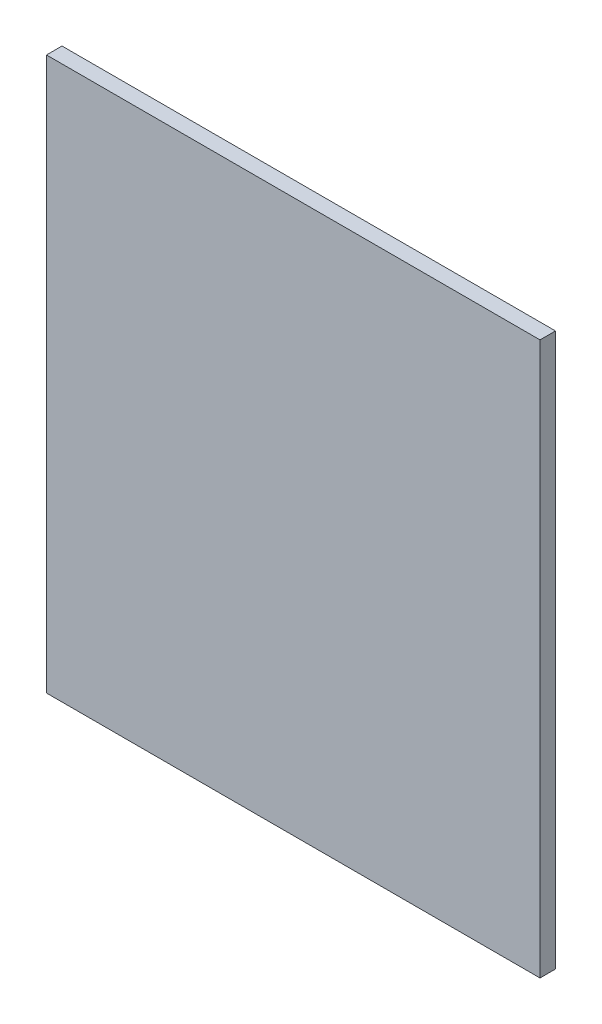
ISO-10303-21;
HEADER;
FILE_DESCRIPTION(('STEP AP214'),'2;1');
FILE_NAME('part.step','',(''),(''),'','','');
FILE_SCHEMA(('AUTOMOTIVE_DESIGN { 1 0 10303 214 1 1 1 1 }'));
ENDSEC;
DATA;
#1=APPLICATION_CONTEXT('core data for automotive mechanical design processes');
#2=APPLICATION_PROTOCOL_DEFINITION('international standard','automotive_design',2000,#1);
#3=PRODUCT_CONTEXT('',#1,'mechanical');
#4=PRODUCT('Part','Part','',(#3));
#5=PRODUCT_RELATED_PRODUCT_CATEGORY('part','',(#4));
#6=PRODUCT_DEFINITION_FORMATION('','',#4);
#7=PRODUCT_DEFINITION_CONTEXT('part definition',#1,'design');
#8=PRODUCT_DEFINITION('design','',#6,#7);
#9=PRODUCT_DEFINITION_SHAPE('','',#8);
#10=(LENGTH_UNIT() NAMED_UNIT(*) SI_UNIT(.MILLI.,.METRE.));
#11=(NAMED_UNIT(*) PLANE_ANGLE_UNIT() SI_UNIT($,.RADIAN.));
#12=(NAMED_UNIT(*) SI_UNIT($,.STERADIAN.) SOLID_ANGLE_UNIT());
#13=UNCERTAINTY_MEASURE_WITH_UNIT(LENGTH_MEASURE(1.E-05),#10,'distance_accuracy_value','');
#14=(GEOMETRIC_REPRESENTATION_CONTEXT(3) GLOBAL_UNCERTAINTY_ASSIGNED_CONTEXT((#13)) GLOBAL_UNIT_ASSIGNED_CONTEXT((#10,
#11,#12)) REPRESENTATION_CONTEXT('',''));
#15=CARTESIAN_POINT('',(0.,0.,0.));
#16=DIRECTION('',(0.,0.,1.));
#17=DIRECTION('',(1.,0.,0.));
#18=AXIS2_PLACEMENT_3D('',#15,#16,#17);
#19=CARTESIAN_POINT('',(337.964035741156,395.838482057915,12.));
#20=DIRECTION('',(0.,-1.,0.));
#21=DIRECTION('',(0.,0.,-1.));
#22=AXIS2_PLACEMENT_3D('',#19,#20,#21);
#23=PLANE('',#22);
#24=DIRECTION('',(-1.,0.,0.));
#25=VECTOR('',#24,1.);
#26=CARTESIAN_POINT('',(337.964035741156,395.838482057915,0.));
#27=LINE('',#26,#25);
#28=CARTESIAN_POINT('',(337.964035741156,395.838482057915,0.));
#29=VERTEX_POINT('',#28);
#30=CARTESIAN_POINT('',(-44.0759642588437,395.838482057915,0.));
#31=VERTEX_POINT('',#30);
#32=EDGE_CURVE('E95',#29,#31,#27,.T.);
#33=ORIENTED_EDGE('',*,*,#32,.T.);
#34=DIRECTION('',(0.,0.,-1.));
#35=VECTOR('',#34,1.);
#36=CARTESIAN_POINT('',(-44.0759642588437,395.838482057915,12.));
#37=LINE('',#36,#35);
#38=CARTESIAN_POINT('',(-44.0759642588437,395.838482057915,12.));
#39=VERTEX_POINT('',#38);
#40=EDGE_CURVE('E11',#39,#31,#37,.T.);
#41=ORIENTED_EDGE('',*,*,#40,.F.);
#42=DIRECTION('',(-1.,0.,0.));
#43=VECTOR('',#42,1.);
#44=CARTESIAN_POINT('',(337.964035741156,395.838482057915,12.));
#45=LINE('',#44,#43);
#46=CARTESIAN_POINT('',(337.964035741156,395.838482057915,12.));
#47=VERTEX_POINT('',#46);
#48=EDGE_CURVE('E83',#47,#39,#45,.T.);
#49=ORIENTED_EDGE('',*,*,#48,.F.);
#50=DIRECTION('',(0.,0.,-1.));
#51=VECTOR('',#50,1.);
#52=CARTESIAN_POINT('',(337.964035741156,395.838482057915,12.));
#53=LINE('',#52,#51);
#54=EDGE_CURVE('E91',#47,#29,#53,.T.);
#55=ORIENTED_EDGE('',*,*,#54,.T.);
#56=EDGE_LOOP('',(#33,#41,#49,#55));
#57=FACE_BOUND('',#56,.T.);
#58=ADVANCED_FACE('F32',(#57),#23,.F.);
#59=CARTESIAN_POINT('',(-44.0759642588437,395.838482057915,12.));
#60=DIRECTION('',(1.,0.,0.));
#61=DIRECTION('',(0.,1.,0.));
#62=AXIS2_PLACEMENT_3D('',#59,#60,#61);
#63=PLANE('',#62);
#64=DIRECTION('',(0.,-1.,0.));
#65=VECTOR('',#64,1.);
#66=CARTESIAN_POINT('',(-44.0759642588437,395.838482057915,0.));
#67=LINE('',#66,#65);
#68=CARTESIAN_POINT('',(-44.0759642588436,-31.9615179420854,0.));
#69=VERTEX_POINT('',#68);
#70=EDGE_CURVE('E87',#31,#69,#67,.T.);
#71=ORIENTED_EDGE('',*,*,#70,.T.);
#72=DIRECTION('',(0.,0.,-1.));
#73=VECTOR('',#72,1.);
#74=CARTESIAN_POINT('',(-44.0759642588436,-31.9615179420854,12.));
#75=LINE('',#74,#73);
#76=CARTESIAN_POINT('',(-44.0759642588436,-31.9615179420854,12.));
#77=VERTEX_POINT('',#76);
#78=EDGE_CURVE('E40',#77,#69,#75,.T.);
#79=ORIENTED_EDGE('',*,*,#78,.F.);
#80=DIRECTION('',(0.,-1.,0.));
#81=VECTOR('',#80,1.);
#82=CARTESIAN_POINT('',(-44.0759642588437,395.838482057915,12.));
#83=LINE('',#82,#81);
#84=EDGE_CURVE('E78',#39,#77,#83,.T.);
#85=ORIENTED_EDGE('',*,*,#84,.F.);
#86=ORIENTED_EDGE('',*,*,#40,.T.);
#87=EDGE_LOOP('',(#71,#79,#85,#86));
#88=FACE_BOUND('',#87,.T.);
#89=ADVANCED_FACE('F86',(#88),#63,.F.);
#90=CARTESIAN_POINT('',(-44.0759642588436,-31.9615179420854,12.));
#91=DIRECTION('',(0.,1.,0.));
#92=DIRECTION('',(0.,0.,1.));
#93=AXIS2_PLACEMENT_3D('',#90,#91,#92);
#94=PLANE('',#93);
#95=DIRECTION('',(1.,0.,0.));
#96=VECTOR('',#95,1.);
#97=CARTESIAN_POINT('',(-44.0759642588436,-31.9615179420854,0.));
#98=LINE('',#97,#96);
#99=CARTESIAN_POINT('',(337.964035741156,-31.9615179420854,0.));
#100=VERTEX_POINT('',#99);
#101=EDGE_CURVE('E65',#69,#100,#98,.T.);
#102=ORIENTED_EDGE('',*,*,#101,.T.);
#103=DIRECTION('',(0.,0.,-1.));
#104=VECTOR('',#103,1.);
#105=CARTESIAN_POINT('',(337.964035741156,-31.9615179420854,12.));
#106=LINE('',#105,#104);
#107=CARTESIAN_POINT('',(337.964035741156,-31.9615179420854,12.));
#108=VERTEX_POINT('',#107);
#109=EDGE_CURVE('E88',#108,#100,#106,.T.);
#110=ORIENTED_EDGE('',*,*,#109,.F.);
#111=DIRECTION('',(1.,0.,0.));
#112=VECTOR('',#111,1.);
#113=CARTESIAN_POINT('',(-44.0759642588436,-31.9615179420854,12.));
#114=LINE('',#113,#112);
#115=EDGE_CURVE('E81',#77,#108,#114,.T.);
#116=ORIENTED_EDGE('',*,*,#115,.F.);
#117=ORIENTED_EDGE('',*,*,#78,.T.);
#118=EDGE_LOOP('',(#102,#110,#116,#117));
#119=FACE_BOUND('',#118,.T.);
#120=ADVANCED_FACE('F89',(#119),#94,.F.);
#121=CARTESIAN_POINT('',(337.964035741156,-31.9615179420854,12.));
#122=DIRECTION('',(-1.,0.,0.));
#123=DIRECTION('',(0.,0.,1.));
#124=AXIS2_PLACEMENT_3D('',#121,#122,#123);
#125=PLANE('',#124);
#126=DIRECTION('',(0.,1.,0.));
#127=VECTOR('',#126,1.);
#128=CARTESIAN_POINT('',(337.964035741156,-31.9615179420854,0.));
#129=LINE('',#128,#127);
#130=EDGE_CURVE('E71',#100,#29,#129,.T.);
#131=ORIENTED_EDGE('',*,*,#130,.T.);
#132=ORIENTED_EDGE('',*,*,#54,.F.);
#133=DIRECTION('',(0.,1.,0.));
#134=VECTOR('',#133,1.);
#135=CARTESIAN_POINT('',(337.964035741156,-31.9615179420854,12.));
#136=LINE('',#135,#134);
#137=EDGE_CURVE('E48',#108,#47,#136,.T.);
#138=ORIENTED_EDGE('',*,*,#137,.F.);
#139=ORIENTED_EDGE('',*,*,#109,.T.);
#140=EDGE_LOOP('',(#131,#132,#138,#139));
#141=FACE_BOUND('',#140,.T.);
#142=ADVANCED_FACE('F102',(#141),#125,.F.);
#143=CARTESIAN_POINT('',(0.,0.,12.));
#144=DIRECTION('',(0.,0.,1.));
#145=DIRECTION('',(1.,0.,0.));
#146=AXIS2_PLACEMENT_3D('',#143,#144,#145);
#147=PLANE('',#146);
#148=ORIENTED_EDGE('',*,*,#48,.T.);
#149=ORIENTED_EDGE('',*,*,#84,.T.);
#150=ORIENTED_EDGE('',*,*,#115,.T.);
#151=ORIENTED_EDGE('',*,*,#137,.T.);
#152=EDGE_LOOP('',(#148,#149,#150,#151));
#153=FACE_BOUND('',#152,.T.);
#154=ADVANCED_FACE('F79',(#153),#147,.T.);
#155=CARTESIAN_POINT('',(0.,0.,0.));
#156=DIRECTION('',(0.,0.,1.));
#157=DIRECTION('',(1.,0.,0.));
#158=AXIS2_PLACEMENT_3D('',#155,#156,#157);
#159=PLANE('',#158);
#160=ORIENTED_EDGE('',*,*,#32,.F.);
#161=ORIENTED_EDGE('',*,*,#130,.F.);
#162=ORIENTED_EDGE('',*,*,#101,.F.);
#163=ORIENTED_EDGE('',*,*,#70,.F.);
#164=EDGE_LOOP('',(#160,#161,#162,#163));
#165=FACE_BOUND('',#164,.T.);
#166=ADVANCED_FACE('F105',(#165),#159,.F.);
#167=CLOSED_SHELL('',(#58,#89,#120,#142,#154,#166));
#168=MANIFOLD_SOLID_BREP('B2',#167);
#169=ADVANCED_BREP_SHAPE_REPRESENTATION('',(#18,#168),#14);
#170=SHAPE_DEFINITION_REPRESENTATION(#9,#169);
ENDSEC;
END-ISO-10303-21;
